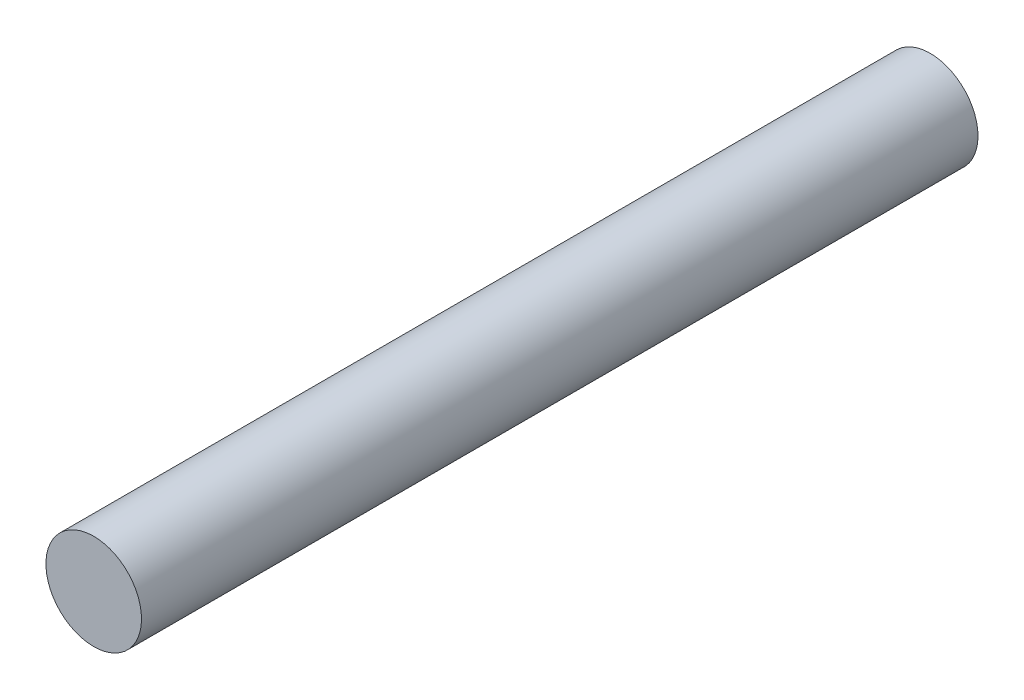
ISO-10303-21;
HEADER;
FILE_DESCRIPTION(('STEP AP214'),'2;1');
FILE_NAME('part.step','',(''),(''),'','','');
FILE_SCHEMA(('AUTOMOTIVE_DESIGN { 1 0 10303 214 1 1 1 1 }'));
ENDSEC;
DATA;
#1=APPLICATION_CONTEXT('core data for automotive mechanical design processes');
#2=APPLICATION_PROTOCOL_DEFINITION('international standard','automotive_design',2000,#1);
#3=PRODUCT_CONTEXT('',#1,'mechanical');
#4=PRODUCT('Part','Part','',(#3));
#5=PRODUCT_RELATED_PRODUCT_CATEGORY('part','',(#4));
#6=PRODUCT_DEFINITION_FORMATION('','',#4);
#7=PRODUCT_DEFINITION_CONTEXT('part definition',#1,'design');
#8=PRODUCT_DEFINITION('design','',#6,#7);
#9=PRODUCT_DEFINITION_SHAPE('','',#8);
#10=(LENGTH_UNIT() NAMED_UNIT(*) SI_UNIT(.MILLI.,.METRE.));
#11=(NAMED_UNIT(*) PLANE_ANGLE_UNIT() SI_UNIT($,.RADIAN.));
#12=(NAMED_UNIT(*) SI_UNIT($,.STERADIAN.) SOLID_ANGLE_UNIT());
#13=UNCERTAINTY_MEASURE_WITH_UNIT(LENGTH_MEASURE(1.E-05),#10,'distance_accuracy_value','');
#14=(GEOMETRIC_REPRESENTATION_CONTEXT(3) GLOBAL_UNCERTAINTY_ASSIGNED_CONTEXT((#13)) GLOBAL_UNIT_ASSIGNED_CONTEXT((#10,
#11,#12)) REPRESENTATION_CONTEXT('',''));
#15=CARTESIAN_POINT('',(0.,0.,0.));
#16=DIRECTION('',(0.,0.,1.));
#17=DIRECTION('',(1.,0.,0.));
#18=AXIS2_PLACEMENT_3D('',#15,#16,#17);
#19=CARTESIAN_POINT('',(0.,0.,17.5));
#20=DIRECTION('',(0.,0.,-1.));
#21=DIRECTION('',(-1.,0.,0.));
#22=AXIS2_PLACEMENT_3D('',#19,#20,#21);
#23=CYLINDRICAL_SURFACE('',#22,1.);
#24=CARTESIAN_POINT('',(0.,0.,17.5));
#25=DIRECTION('',(0.,0.,1.));
#26=DIRECTION('',(1.,0.,0.));
#27=AXIS2_PLACEMENT_3D('',#24,#25,#26);
#28=CIRCLE('',#27,1.);
#29=CARTESIAN_POINT('',(1.,0.,17.5));
#30=VERTEX_POINT('',#29);
#31=EDGE_CURVE('E10',#30,#30,#28,.T.);
#32=ORIENTED_EDGE('',*,*,#31,.F.);
#33=EDGE_LOOP('',(#32));
#34=FACE_BOUND('',#33,.T.);
#35=CARTESIAN_POINT('',(0.,0.,0.));
#36=DIRECTION('',(0.,0.,1.));
#37=DIRECTION('',(1.,0.,0.));
#38=AXIS2_PLACEMENT_3D('',#35,#36,#37);
#39=CIRCLE('',#38,1.);
#40=CARTESIAN_POINT('',(1.,0.,0.));
#41=VERTEX_POINT('',#40);
#42=EDGE_CURVE('E38',#41,#41,#39,.T.);
#43=ORIENTED_EDGE('',*,*,#42,.T.);
#44=EDGE_LOOP('',(#43));
#45=FACE_BOUND('',#44,.T.);
#46=ADVANCED_FACE('F35',(#34,#45),#23,.T.);
#47=CARTESIAN_POINT('',(0.,0.,17.5));
#48=DIRECTION('',(0.,0.,1.));
#49=DIRECTION('',(1.,0.,0.));
#50=AXIS2_PLACEMENT_3D('',#47,#48,#49);
#51=PLANE('',#50);
#52=ORIENTED_EDGE('',*,*,#31,.T.);
#53=EDGE_LOOP('',(#52));
#54=FACE_BOUND('',#53,.T.);
#55=ADVANCED_FACE('F50',(#54),#51,.T.);
#56=CARTESIAN_POINT('',(0.,0.,0.));
#57=DIRECTION('',(0.,0.,1.));
#58=DIRECTION('',(1.,0.,0.));
#59=AXIS2_PLACEMENT_3D('',#56,#57,#58);
#60=PLANE('',#59);
#61=ORIENTED_EDGE('',*,*,#42,.F.);
#62=EDGE_LOOP('',(#61));
#63=FACE_BOUND('',#62,.T.);
#64=ADVANCED_FACE('F48',(#63),#60,.F.);
#65=CLOSED_SHELL('',(#46,#55,#64));
#66=MANIFOLD_SOLID_BREP('B2',#65);
#67=ADVANCED_BREP_SHAPE_REPRESENTATION('',(#18,#66),#14);
#68=SHAPE_DEFINITION_REPRESENTATION(#9,#67);
ENDSEC;
END-ISO-10303-21;
